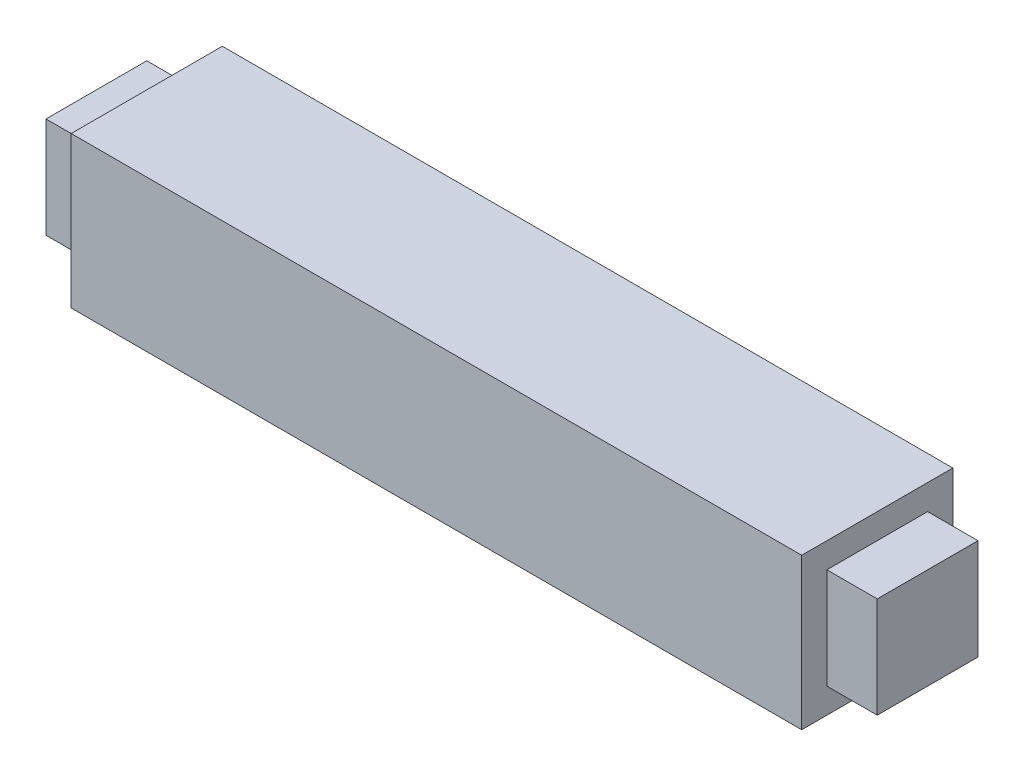
ISO-10303-21;
HEADER;
FILE_DESCRIPTION(('STEP AP214'),'2;1');
FILE_NAME('part.step','',(''),(''),'','','');
FILE_SCHEMA(('AUTOMOTIVE_DESIGN { 1 0 10303 214 1 1 1 1 }'));
ENDSEC;
DATA;
#1=APPLICATION_CONTEXT('core data for automotive mechanical design processes');
#2=APPLICATION_PROTOCOL_DEFINITION('international standard','automotive_design',2000,#1);
#3=PRODUCT_CONTEXT('',#1,'mechanical');
#4=PRODUCT('Part','Part','',(#3));
#5=PRODUCT_RELATED_PRODUCT_CATEGORY('part','',(#4));
#6=PRODUCT_DEFINITION_FORMATION('','',#4);
#7=PRODUCT_DEFINITION_CONTEXT('part definition',#1,'design');
#8=PRODUCT_DEFINITION('design','',#6,#7);
#9=PRODUCT_DEFINITION_SHAPE('','',#8);
#10=(LENGTH_UNIT() NAMED_UNIT(*) SI_UNIT(.MILLI.,.METRE.));
#11=(NAMED_UNIT(*) PLANE_ANGLE_UNIT() SI_UNIT($,.RADIAN.));
#12=(NAMED_UNIT(*) SI_UNIT($,.STERADIAN.) SOLID_ANGLE_UNIT());
#13=UNCERTAINTY_MEASURE_WITH_UNIT(LENGTH_MEASURE(1.E-05),#10,'distance_accuracy_value','');
#14=(GEOMETRIC_REPRESENTATION_CONTEXT(3) GLOBAL_UNCERTAINTY_ASSIGNED_CONTEXT((#13)) GLOBAL_UNIT_ASSIGNED_CONTEXT((#10,
#11,#12)) REPRESENTATION_CONTEXT('',''));
#15=CARTESIAN_POINT('',(0.,0.,0.));
#16=DIRECTION('',(0.,0.,1.));
#17=DIRECTION('',(1.,0.,0.));
#18=AXIS2_PLACEMENT_3D('',#15,#16,#17);
#19=CARTESIAN_POINT('',(-72.5,-15.,15.));
#20=DIRECTION('',(1.,0.,0.));
#21=DIRECTION('',(0.,0.,-1.));
#22=AXIS2_PLACEMENT_3D('',#19,#20,#21);
#23=PLANE('',#22);
#24=DIRECTION('',(0.,-1.,0.));
#25=VECTOR('',#24,1.);
#26=CARTESIAN_POINT('',(-72.5,-15.,-15.));
#27=LINE('',#26,#25);
#28=CARTESIAN_POINT('',(-72.5,15.,-15.));
#29=VERTEX_POINT('',#28);
#30=CARTESIAN_POINT('',(-72.5,-15.,-15.));
#31=VERTEX_POINT('',#30);
#32=EDGE_CURVE('E186',#29,#31,#27,.T.);
#33=ORIENTED_EDGE('',*,*,#32,.T.);
#34=DIRECTION('',(0.,0.,-1.));
#35=VECTOR('',#34,1.);
#36=CARTESIAN_POINT('',(-72.5,-15.,15.));
#37=LINE('',#36,#35);
#38=CARTESIAN_POINT('',(-72.5,-15.,15.));
#39=VERTEX_POINT('',#38);
#40=EDGE_CURVE('E11',#39,#31,#37,.T.);
#41=ORIENTED_EDGE('',*,*,#40,.F.);
#42=DIRECTION('',(0.,-1.,0.));
#43=VECTOR('',#42,1.);
#44=CARTESIAN_POINT('',(-72.5,-15.,15.));
#45=LINE('',#44,#43);
#46=CARTESIAN_POINT('',(-72.5,15.,15.));
#47=VERTEX_POINT('',#46);
#48=EDGE_CURVE('E188',#47,#39,#45,.T.);
#49=ORIENTED_EDGE('',*,*,#48,.F.);
#50=DIRECTION('',(0.,0.,-1.));
#51=VECTOR('',#50,1.);
#52=CARTESIAN_POINT('',(-72.5,15.,15.));
#53=LINE('',#52,#51);
#54=EDGE_CURVE('E199',#47,#29,#53,.T.);
#55=ORIENTED_EDGE('',*,*,#54,.T.);
#56=EDGE_LOOP('',(#33,#41,#49,#55));
#57=FACE_BOUND('',#56,.T.);
#58=DIRECTION('',(0.,-1.,0.));
#59=VECTOR('',#58,1.);
#60=CARTESIAN_POINT('',(-72.5,-10.,-10.));
#61=LINE('',#60,#59);
#62=CARTESIAN_POINT('',(-72.5,10.,-10.));
#63=VERTEX_POINT('',#62);
#64=CARTESIAN_POINT('',(-72.5,-10.,-10.));
#65=VERTEX_POINT('',#64);
#66=EDGE_CURVE('E60',#63,#65,#61,.T.);
#67=ORIENTED_EDGE('',*,*,#66,.F.);
#68=DIRECTION('',(0.,0.,-1.));
#69=VECTOR('',#68,1.);
#70=CARTESIAN_POINT('',(-72.5,10.,-10.));
#71=LINE('',#70,#69);
#72=CARTESIAN_POINT('',(-72.5,10.,10.));
#73=VERTEX_POINT('',#72);
#74=EDGE_CURVE('E62',#73,#63,#71,.T.);
#75=ORIENTED_EDGE('',*,*,#74,.F.);
#76=DIRECTION('',(0.,1.,0.));
#77=VECTOR('',#76,1.);
#78=CARTESIAN_POINT('',(-72.5,-10.,10.));
#79=LINE('',#78,#77);
#80=CARTESIAN_POINT('',(-72.5,-10.,10.));
#81=VERTEX_POINT('',#80);
#82=EDGE_CURVE('E384',#81,#73,#79,.T.);
#83=ORIENTED_EDGE('',*,*,#82,.F.);
#84=DIRECTION('',(0.,0.,1.));
#85=VECTOR('',#84,1.);
#86=CARTESIAN_POINT('',(-72.5,-10.,-10.));
#87=LINE('',#86,#85);
#88=EDGE_CURVE('E392',#65,#81,#87,.T.);
#89=ORIENTED_EDGE('',*,*,#88,.F.);
#90=EDGE_LOOP('',(#67,#75,#83,#89));
#91=FACE_BOUND('',#90,.T.);
#92=ADVANCED_FACE('F43',(#57,#91),#23,.F.);
#93=CARTESIAN_POINT('',(72.5,-15.,15.));
#94=DIRECTION('',(-1.,0.,0.));
#95=DIRECTION('',(0.,0.,1.));
#96=AXIS2_PLACEMENT_3D('',#93,#94,#95);
#97=PLANE('',#96);
#98=DIRECTION('',(0.,1.,0.));
#99=VECTOR('',#98,1.);
#100=CARTESIAN_POINT('',(72.5,-15.,-15.));
#101=LINE('',#100,#99);
#102=CARTESIAN_POINT('',(72.5,-15.,-15.));
#103=VERTEX_POINT('',#102);
#104=CARTESIAN_POINT('',(72.5,15.,-15.));
#105=VERTEX_POINT('',#104);
#106=EDGE_CURVE('E202',#103,#105,#101,.T.);
#107=ORIENTED_EDGE('',*,*,#106,.T.);
#108=DIRECTION('',(0.,0.,-1.));
#109=VECTOR('',#108,1.);
#110=CARTESIAN_POINT('',(72.5,15.,15.));
#111=LINE('',#110,#109);
#112=CARTESIAN_POINT('',(72.5,15.,15.));
#113=VERTEX_POINT('',#112);
#114=EDGE_CURVE('E209',#113,#105,#111,.T.);
#115=ORIENTED_EDGE('',*,*,#114,.F.);
#116=DIRECTION('',(0.,1.,0.));
#117=VECTOR('',#116,1.);
#118=CARTESIAN_POINT('',(72.5,-15.,15.));
#119=LINE('',#118,#117);
#120=CARTESIAN_POINT('',(72.5,-15.,15.));
#121=VERTEX_POINT('',#120);
#122=EDGE_CURVE('E198',#121,#113,#119,.T.);
#123=ORIENTED_EDGE('',*,*,#122,.F.);
#124=DIRECTION('',(0.,0.,-1.));
#125=VECTOR('',#124,1.);
#126=CARTESIAN_POINT('',(72.5,-15.,15.));
#127=LINE('',#126,#125);
#128=EDGE_CURVE('E49',#121,#103,#127,.T.);
#129=ORIENTED_EDGE('',*,*,#128,.T.);
#130=EDGE_LOOP('',(#107,#115,#123,#129));
#131=FACE_BOUND('',#130,.T.);
#132=DIRECTION('',(0.,-1.,0.));
#133=VECTOR('',#132,1.);
#134=CARTESIAN_POINT('',(72.5,-10.,10.));
#135=LINE('',#134,#133);
#136=CARTESIAN_POINT('',(72.5,10.,10.));
#137=VERTEX_POINT('',#136);
#138=CARTESIAN_POINT('',(72.5,-10.,10.));
#139=VERTEX_POINT('',#138);
#140=EDGE_CURVE('E151',#137,#139,#135,.T.);
#141=ORIENTED_EDGE('',*,*,#140,.F.);
#142=DIRECTION('',(0.,0.,1.));
#143=VECTOR('',#142,1.);
#144=CARTESIAN_POINT('',(72.5,10.,10.));
#145=LINE('',#144,#143);
#146=CARTESIAN_POINT('',(72.5,10.,-10.));
#147=VERTEX_POINT('',#146);
#148=EDGE_CURVE('E163',#147,#137,#145,.T.);
#149=ORIENTED_EDGE('',*,*,#148,.F.);
#150=DIRECTION('',(0.,1.,0.));
#151=VECTOR('',#150,1.);
#152=CARTESIAN_POINT('',(72.5,-10.,-10.));
#153=LINE('',#152,#151);
#154=CARTESIAN_POINT('',(72.5,-10.,-10.));
#155=VERTEX_POINT('',#154);
#156=EDGE_CURVE('E174',#155,#147,#153,.T.);
#157=ORIENTED_EDGE('',*,*,#156,.F.);
#158=DIRECTION('',(0.,0.,-1.));
#159=VECTOR('',#158,1.);
#160=CARTESIAN_POINT('',(72.5,-10.,10.));
#161=LINE('',#160,#159);
#162=EDGE_CURVE('E152',#139,#155,#161,.T.);
#163=ORIENTED_EDGE('',*,*,#162,.F.);
#164=EDGE_LOOP('',(#141,#149,#157,#163));
#165=FACE_BOUND('',#164,.T.);
#166=ADVANCED_FACE('F220',(#131,#165),#97,.F.);
#167=CARTESIAN_POINT('',(-72.5,-15.,15.));
#168=DIRECTION('',(0.,1.,0.));
#169=DIRECTION('',(0.,0.,1.));
#170=AXIS2_PLACEMENT_3D('',#167,#168,#169);
#171=PLANE('',#170);
#172=DIRECTION('',(1.,0.,0.));
#173=VECTOR('',#172,1.);
#174=CARTESIAN_POINT('',(-72.5,-15.,-15.));
#175=LINE('',#174,#173);
#176=EDGE_CURVE('E201',#31,#103,#175,.T.);
#177=ORIENTED_EDGE('',*,*,#176,.T.);
#178=ORIENTED_EDGE('',*,*,#128,.F.);
#179=DIRECTION('',(1.,0.,0.));
#180=VECTOR('',#179,1.);
#181=CARTESIAN_POINT('',(-72.5,-15.,15.));
#182=LINE('',#181,#180);
#183=EDGE_CURVE('E194',#39,#121,#182,.T.);
#184=ORIENTED_EDGE('',*,*,#183,.F.);
#185=ORIENTED_EDGE('',*,*,#40,.T.);
#186=EDGE_LOOP('',(#177,#178,#184,#185));
#187=FACE_BOUND('',#186,.T.);
#188=ADVANCED_FACE('F231',(#187),#171,.F.);
#189=CARTESIAN_POINT('',(-72.5,15.,15.));
#190=DIRECTION('',(0.,-1.,0.));
#191=DIRECTION('',(0.,0.,-1.));
#192=AXIS2_PLACEMENT_3D('',#189,#190,#191);
#193=PLANE('',#192);
#194=DIRECTION('',(-1.,0.,0.));
#195=VECTOR('',#194,1.);
#196=CARTESIAN_POINT('',(-72.5,15.,-15.));
#197=LINE('',#196,#195);
#198=EDGE_CURVE('E191',#105,#29,#197,.T.);
#199=ORIENTED_EDGE('',*,*,#198,.T.);
#200=ORIENTED_EDGE('',*,*,#54,.F.);
#201=DIRECTION('',(-1.,0.,0.));
#202=VECTOR('',#201,1.);
#203=CARTESIAN_POINT('',(-72.5,15.,15.));
#204=LINE('',#203,#202);
#205=EDGE_CURVE('E196',#113,#47,#204,.T.);
#206=ORIENTED_EDGE('',*,*,#205,.F.);
#207=ORIENTED_EDGE('',*,*,#114,.T.);
#208=EDGE_LOOP('',(#199,#200,#206,#207));
#209=FACE_BOUND('',#208,.T.);
#210=ADVANCED_FACE('F230',(#209),#193,.F.);
#211=CARTESIAN_POINT('',(0.,0.,15.));
#212=DIRECTION('',(0.,0.,-1.));
#213=DIRECTION('',(-1.,0.,0.));
#214=AXIS2_PLACEMENT_3D('',#211,#212,#213);
#215=PLANE('',#214);
#216=ORIENTED_EDGE('',*,*,#48,.T.);
#217=ORIENTED_EDGE('',*,*,#183,.T.);
#218=ORIENTED_EDGE('',*,*,#122,.T.);
#219=ORIENTED_EDGE('',*,*,#205,.T.);
#220=EDGE_LOOP('',(#216,#217,#218,#219));
#221=FACE_BOUND('',#220,.T.);
#222=ADVANCED_FACE('F234',(#221),#215,.F.);
#223=CARTESIAN_POINT('',(0.,0.,-15.));
#224=DIRECTION('',(0.,0.,-1.));
#225=DIRECTION('',(-1.,0.,0.));
#226=AXIS2_PLACEMENT_3D('',#223,#224,#225);
#227=PLANE('',#226);
#228=ORIENTED_EDGE('',*,*,#32,.F.);
#229=ORIENTED_EDGE('',*,*,#198,.F.);
#230=ORIENTED_EDGE('',*,*,#106,.F.);
#231=ORIENTED_EDGE('',*,*,#176,.F.);
#232=EDGE_LOOP('',(#228,#229,#230,#231));
#233=FACE_BOUND('',#232,.T.);
#234=ADVANCED_FACE('F221',(#233),#227,.T.);
#235=CARTESIAN_POINT('',(82.5,-10.,10.));
#236=DIRECTION('',(0.,0.,-1.));
#237=DIRECTION('',(-1.,0.,0.));
#238=AXIS2_PLACEMENT_3D('',#235,#236,#237);
#239=PLANE('',#238);
#240=ORIENTED_EDGE('',*,*,#140,.T.);
#241=DIRECTION('',(-1.,0.,0.));
#242=VECTOR('',#241,1.);
#243=CARTESIAN_POINT('',(82.5,-10.,10.));
#244=LINE('',#243,#242);
#245=CARTESIAN_POINT('',(82.5,-10.,10.));
#246=VERTEX_POINT('',#245);
#247=EDGE_CURVE('E187',#246,#139,#244,.T.);
#248=ORIENTED_EDGE('',*,*,#247,.F.);
#249=DIRECTION('',(0.,-1.,0.));
#250=VECTOR('',#249,1.);
#251=CARTESIAN_POINT('',(82.5,-10.,10.));
#252=LINE('',#251,#250);
#253=CARTESIAN_POINT('',(82.5,10.,10.));
#254=VERTEX_POINT('',#253);
#255=EDGE_CURVE('E159',#254,#246,#252,.T.);
#256=ORIENTED_EDGE('',*,*,#255,.F.);
#257=DIRECTION('',(-1.,0.,0.));
#258=VECTOR('',#257,1.);
#259=CARTESIAN_POINT('',(82.5,10.,10.));
#260=LINE('',#259,#258);
#261=EDGE_CURVE('E166',#254,#137,#260,.T.);
#262=ORIENTED_EDGE('',*,*,#261,.T.);
#263=EDGE_LOOP('',(#240,#248,#256,#262));
#264=FACE_BOUND('',#263,.T.);
#265=ADVANCED_FACE('F309',(#264),#239,.F.);
#266=CARTESIAN_POINT('',(82.5,-10.,10.));
#267=DIRECTION('',(0.,1.,0.));
#268=DIRECTION('',(0.,0.,1.));
#269=AXIS2_PLACEMENT_3D('',#266,#267,#268);
#270=PLANE('',#269);
#271=ORIENTED_EDGE('',*,*,#162,.T.);
#272=DIRECTION('',(-1.,0.,0.));
#273=VECTOR('',#272,1.);
#274=CARTESIAN_POINT('',(82.5,-10.,-10.));
#275=LINE('',#274,#273);
#276=CARTESIAN_POINT('',(82.5,-10.,-10.));
#277=VERTEX_POINT('',#276);
#278=EDGE_CURVE('E181',#277,#155,#275,.T.);
#279=ORIENTED_EDGE('',*,*,#278,.F.);
#280=DIRECTION('',(0.,0.,-1.));
#281=VECTOR('',#280,1.);
#282=CARTESIAN_POINT('',(82.5,-10.,10.));
#283=LINE('',#282,#281);
#284=EDGE_CURVE('E162',#246,#277,#283,.T.);
#285=ORIENTED_EDGE('',*,*,#284,.F.);
#286=ORIENTED_EDGE('',*,*,#247,.T.);
#287=EDGE_LOOP('',(#271,#279,#285,#286));
#288=FACE_BOUND('',#287,.T.);
#289=ADVANCED_FACE('F308',(#288),#270,.F.);
#290=CARTESIAN_POINT('',(82.5,-10.,-10.));
#291=DIRECTION('',(0.,0.,1.));
#292=DIRECTION('',(1.,0.,0.));
#293=AXIS2_PLACEMENT_3D('',#290,#291,#292);
#294=PLANE('',#293);
#295=ORIENTED_EDGE('',*,*,#156,.T.);
#296=DIRECTION('',(-1.,0.,0.));
#297=VECTOR('',#296,1.);
#298=CARTESIAN_POINT('',(82.5,10.,-10.));
#299=LINE('',#298,#297);
#300=CARTESIAN_POINT('',(82.5,10.,-10.));
#301=VERTEX_POINT('',#300);
#302=EDGE_CURVE('E178',#301,#147,#299,.T.);
#303=ORIENTED_EDGE('',*,*,#302,.F.);
#304=DIRECTION('',(0.,1.,0.));
#305=VECTOR('',#304,1.);
#306=CARTESIAN_POINT('',(82.5,-10.,-10.));
#307=LINE('',#306,#305);
#308=EDGE_CURVE('E167',#277,#301,#307,.T.);
#309=ORIENTED_EDGE('',*,*,#308,.F.);
#310=ORIENTED_EDGE('',*,*,#278,.T.);
#311=EDGE_LOOP('',(#295,#303,#309,#310));
#312=FACE_BOUND('',#311,.T.);
#313=ADVANCED_FACE('F305',(#312),#294,.F.);
#314=CARTESIAN_POINT('',(82.5,10.,10.));
#315=DIRECTION('',(0.,-1.,0.));
#316=DIRECTION('',(0.,0.,-1.));
#317=AXIS2_PLACEMENT_3D('',#314,#315,#316);
#318=PLANE('',#317);
#319=ORIENTED_EDGE('',*,*,#148,.T.);
#320=ORIENTED_EDGE('',*,*,#261,.F.);
#321=DIRECTION('',(0.,0.,1.));
#322=VECTOR('',#321,1.);
#323=CARTESIAN_POINT('',(82.5,10.,10.));
#324=LINE('',#323,#322);
#325=EDGE_CURVE('E169',#301,#254,#324,.T.);
#326=ORIENTED_EDGE('',*,*,#325,.F.);
#327=ORIENTED_EDGE('',*,*,#302,.T.);
#328=EDGE_LOOP('',(#319,#320,#326,#327));
#329=FACE_BOUND('',#328,.T.);
#330=ADVANCED_FACE('F296',(#329),#318,.F.);
#331=CARTESIAN_POINT('',(82.5,0.,0.));
#332=DIRECTION('',(-1.,0.,0.));
#333=DIRECTION('',(0.,0.,1.));
#334=AXIS2_PLACEMENT_3D('',#331,#332,#333);
#335=PLANE('',#334);
#336=ORIENTED_EDGE('',*,*,#255,.T.);
#337=ORIENTED_EDGE('',*,*,#284,.T.);
#338=ORIENTED_EDGE('',*,*,#308,.T.);
#339=ORIENTED_EDGE('',*,*,#325,.T.);
#340=EDGE_LOOP('',(#336,#337,#338,#339));
#341=FACE_BOUND('',#340,.T.);
#342=ADVANCED_FACE('F253',(#341),#335,.F.);
#343=CARTESIAN_POINT('',(-82.5,-10.,-10.));
#344=DIRECTION('',(0.,0.,1.));
#345=DIRECTION('',(1.,0.,0.));
#346=AXIS2_PLACEMENT_3D('',#343,#344,#345);
#347=PLANE('',#346);
#348=ORIENTED_EDGE('',*,*,#66,.T.);
#349=DIRECTION('',(1.,0.,0.));
#350=VECTOR('',#349,1.);
#351=CARTESIAN_POINT('',(-82.5,-10.,-10.));
#352=LINE('',#351,#350);
#353=CARTESIAN_POINT('',(-82.5,-10.,-10.));
#354=VERTEX_POINT('',#353);
#355=EDGE_CURVE('E131',#354,#65,#352,.T.);
#356=ORIENTED_EDGE('',*,*,#355,.F.);
#357=DIRECTION('',(0.,-1.,0.));
#358=VECTOR('',#357,1.);
#359=CARTESIAN_POINT('',(-82.5,-10.,-10.));
#360=LINE('',#359,#358);
#361=CARTESIAN_POINT('',(-82.5,10.,-10.));
#362=VERTEX_POINT('',#361);
#363=EDGE_CURVE('E138',#362,#354,#360,.T.);
#364=ORIENTED_EDGE('',*,*,#363,.F.);
#365=DIRECTION('',(1.,0.,0.));
#366=VECTOR('',#365,1.);
#367=CARTESIAN_POINT('',(-82.5,10.,-10.));
#368=LINE('',#367,#366);
#369=EDGE_CURVE('E382',#362,#63,#368,.T.);
#370=ORIENTED_EDGE('',*,*,#369,.T.);
#371=EDGE_LOOP('',(#348,#356,#364,#370));
#372=FACE_BOUND('',#371,.T.);
#373=ADVANCED_FACE('F147',(#372),#347,.F.);
#374=CARTESIAN_POINT('',(-82.5,-10.,-10.));
#375=DIRECTION('',(0.,1.,0.));
#376=DIRECTION('',(0.,0.,1.));
#377=AXIS2_PLACEMENT_3D('',#374,#375,#376);
#378=PLANE('',#377);
#379=ORIENTED_EDGE('',*,*,#88,.T.);
#380=DIRECTION('',(1.,0.,0.));
#381=VECTOR('',#380,1.);
#382=CARTESIAN_POINT('',(-82.5,-10.,10.));
#383=LINE('',#382,#381);
#384=CARTESIAN_POINT('',(-82.5,-10.,10.));
#385=VERTEX_POINT('',#384);
#386=EDGE_CURVE('E137',#385,#81,#383,.T.);
#387=ORIENTED_EDGE('',*,*,#386,.F.);
#388=DIRECTION('',(0.,0.,1.));
#389=VECTOR('',#388,1.);
#390=CARTESIAN_POINT('',(-82.5,-10.,-10.));
#391=LINE('',#390,#389);
#392=EDGE_CURVE('E129',#354,#385,#391,.T.);
#393=ORIENTED_EDGE('',*,*,#392,.F.);
#394=ORIENTED_EDGE('',*,*,#355,.T.);
#395=EDGE_LOOP('',(#379,#387,#393,#394));
#396=FACE_BOUND('',#395,.T.);
#397=ADVANCED_FACE('F135',(#396),#378,.F.);
#398=CARTESIAN_POINT('',(-82.5,-10.,10.));
#399=DIRECTION('',(0.,0.,-1.));
#400=DIRECTION('',(-1.,0.,0.));
#401=AXIS2_PLACEMENT_3D('',#398,#399,#400);
#402=PLANE('',#401);
#403=ORIENTED_EDGE('',*,*,#82,.T.);
#404=DIRECTION('',(1.,0.,0.));
#405=VECTOR('',#404,1.);
#406=CARTESIAN_POINT('',(-82.5,10.,10.));
#407=LINE('',#406,#405);
#408=CARTESIAN_POINT('',(-82.5,10.,10.));
#409=VERTEX_POINT('',#408);
#410=EDGE_CURVE('E156',#409,#73,#407,.T.);
#411=ORIENTED_EDGE('',*,*,#410,.F.);
#412=DIRECTION('',(0.,1.,0.));
#413=VECTOR('',#412,1.);
#414=CARTESIAN_POINT('',(-82.5,-10.,10.));
#415=LINE('',#414,#413);
#416=EDGE_CURVE('E136',#385,#409,#415,.T.);
#417=ORIENTED_EDGE('',*,*,#416,.F.);
#418=ORIENTED_EDGE('',*,*,#386,.T.);
#419=EDGE_LOOP('',(#403,#411,#417,#418));
#420=FACE_BOUND('',#419,.T.);
#421=ADVANCED_FACE('F262',(#420),#402,.F.);
#422=CARTESIAN_POINT('',(-82.5,10.,-10.));
#423=DIRECTION('',(0.,-1.,0.));
#424=DIRECTION('',(0.,0.,-1.));
#425=AXIS2_PLACEMENT_3D('',#422,#423,#424);
#426=PLANE('',#425);
#427=ORIENTED_EDGE('',*,*,#74,.T.);
#428=ORIENTED_EDGE('',*,*,#369,.F.);
#429=DIRECTION('',(0.,0.,-1.));
#430=VECTOR('',#429,1.);
#431=CARTESIAN_POINT('',(-82.5,10.,-10.));
#432=LINE('',#431,#430);
#433=EDGE_CURVE('E144',#409,#362,#432,.T.);
#434=ORIENTED_EDGE('',*,*,#433,.F.);
#435=ORIENTED_EDGE('',*,*,#410,.T.);
#436=EDGE_LOOP('',(#427,#428,#434,#435));
#437=FACE_BOUND('',#436,.T.);
#438=ADVANCED_FACE('F275',(#437),#426,.F.);
#439=CARTESIAN_POINT('',(-82.5,0.,0.));
#440=DIRECTION('',(1.,0.,0.));
#441=DIRECTION('',(0.,0.,-1.));
#442=AXIS2_PLACEMENT_3D('',#439,#440,#441);
#443=PLANE('',#442);
#444=ORIENTED_EDGE('',*,*,#363,.T.);
#445=ORIENTED_EDGE('',*,*,#392,.T.);
#446=ORIENTED_EDGE('',*,*,#416,.T.);
#447=ORIENTED_EDGE('',*,*,#433,.T.);
#448=EDGE_LOOP('',(#444,#445,#446,#447));
#449=FACE_BOUND('',#448,.T.);
#450=ADVANCED_FACE('F141',(#449),#443,.F.);
#451=CLOSED_SHELL('',(#92,#166,#188,#210,#222,#234,#265,#289,#313,#330,#342,#373,#397,#421,#438,#450));
#452=MANIFOLD_SOLID_BREP('B2',#451);
#453=ADVANCED_BREP_SHAPE_REPRESENTATION('',(#18,#452),#14);
#454=SHAPE_DEFINITION_REPRESENTATION(#9,#453);
ENDSEC;
END-ISO-10303-21;
